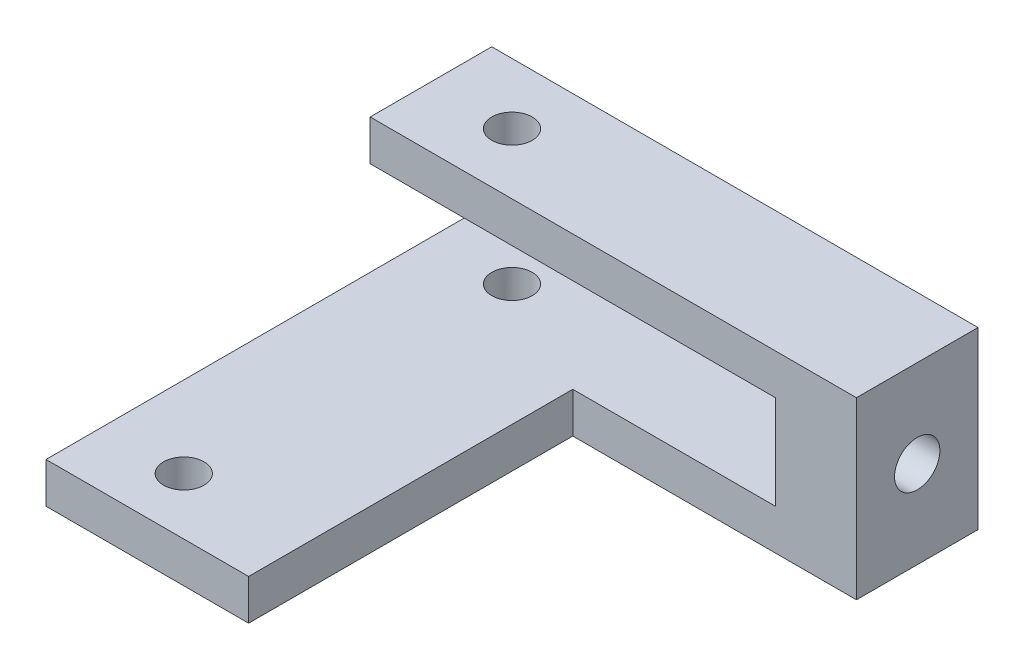
ISO-10303-21;
HEADER;
FILE_DESCRIPTION(('STEP AP214'),'2;1');
FILE_NAME('part.step','',(''),(''),'','','');
FILE_SCHEMA(('AUTOMOTIVE_DESIGN { 1 0 10303 214 1 1 1 1 }'));
ENDSEC;
DATA;
#1=APPLICATION_CONTEXT('core data for automotive mechanical design processes');
#2=APPLICATION_PROTOCOL_DEFINITION('international standard','automotive_design',2000,#1);
#3=PRODUCT_CONTEXT('',#1,'mechanical');
#4=PRODUCT('Part','Part','',(#3));
#5=PRODUCT_RELATED_PRODUCT_CATEGORY('part','',(#4));
#6=PRODUCT_DEFINITION_FORMATION('','',#4);
#7=PRODUCT_DEFINITION_CONTEXT('part definition',#1,'design');
#8=PRODUCT_DEFINITION('design','',#6,#7);
#9=PRODUCT_DEFINITION_SHAPE('','',#8);
#10=(LENGTH_UNIT() NAMED_UNIT(*) SI_UNIT(.MILLI.,.METRE.));
#11=(NAMED_UNIT(*) PLANE_ANGLE_UNIT() SI_UNIT($,.RADIAN.));
#12=(NAMED_UNIT(*) SI_UNIT($,.STERADIAN.) SOLID_ANGLE_UNIT());
#13=UNCERTAINTY_MEASURE_WITH_UNIT(LENGTH_MEASURE(1.E-05),#10,'distance_accuracy_value','');
#14=(GEOMETRIC_REPRESENTATION_CONTEXT(3) GLOBAL_UNCERTAINTY_ASSIGNED_CONTEXT((#13)) GLOBAL_UNIT_ASSIGNED_CONTEXT((#10,
#11,#12)) REPRESENTATION_CONTEXT('',''));
#15=CARTESIAN_POINT('',(0.,0.,0.));
#16=DIRECTION('',(0.,0.,1.));
#17=DIRECTION('',(1.,0.,0.));
#18=AXIS2_PLACEMENT_3D('',#15,#16,#17);
#19=CARTESIAN_POINT('',(0.,0.,19.05));
#20=DIRECTION('',(-1.,0.,0.));
#21=DIRECTION('',(0.,1.,0.));
#22=AXIS2_PLACEMENT_3D('',#19,#20,#21);
#23=PLANE('',#22);
#24=CARTESIAN_POINT('',(0.,-13.716,9.525));
#25=DIRECTION('',(-1.,0.,0.));
#26=DIRECTION('',(0.,0.,1.));
#27=AXIS2_PLACEMENT_3D('',#24,#25,#26);
#28=CIRCLE('',#27,3.556);
#29=CARTESIAN_POINT('',(0.,-13.716,13.081));
#30=VERTEX_POINT('',#29);
#31=EDGE_CURVE('E288',#30,#30,#28,.T.);
#32=ORIENTED_EDGE('',*,*,#31,.T.);
#33=EDGE_LOOP('',(#32));
#34=FACE_BOUND('',#33,.T.);
#35=DIRECTION('',(0.,-1.,0.));
#36=VECTOR('',#35,1.);
#37=CARTESIAN_POINT('',(0.,0.,0.));
#38=LINE('',#37,#36);
#39=CARTESIAN_POINT('',(0.,0.,0.));
#40=VERTEX_POINT('',#39);
#41=CARTESIAN_POINT('',(0.,-27.432,0.));
#42=VERTEX_POINT('',#41);
#43=EDGE_CURVE('E152',#40,#42,#38,.T.);
#44=ORIENTED_EDGE('',*,*,#43,.F.);
#45=DIRECTION('',(0.,0.,-1.));
#46=VECTOR('',#45,1.);
#47=CARTESIAN_POINT('',(0.,0.,19.05));
#48=LINE('',#47,#46);
#49=CARTESIAN_POINT('',(0.,0.,19.05));
#50=VERTEX_POINT('',#49);
#51=EDGE_CURVE('E151',#50,#40,#48,.T.);
#52=ORIENTED_EDGE('',*,*,#51,.F.);
#53=DIRECTION('',(0.,-1.,0.));
#54=VECTOR('',#53,1.);
#55=CARTESIAN_POINT('',(0.,0.,19.05));
#56=LINE('',#55,#54);
#57=CARTESIAN_POINT('',(0.,-27.432,19.05));
#58=VERTEX_POINT('',#57);
#59=EDGE_CURVE('E179',#50,#58,#56,.T.);
#60=ORIENTED_EDGE('',*,*,#59,.T.);
#61=DIRECTION('',(0.,0.,-1.));
#62=VECTOR('',#61,1.);
#63=CARTESIAN_POINT('',(0.,-27.432,19.05));
#64=LINE('',#63,#62);
#65=EDGE_CURVE('E11',#58,#42,#64,.T.);
#66=ORIENTED_EDGE('',*,*,#65,.T.);
#67=EDGE_LOOP('',(#44,#52,#60,#66));
#68=FACE_BOUND('',#67,.T.);
#69=ADVANCED_FACE('F41',(#34,#68),#23,.F.);
#70=CARTESIAN_POINT('',(0.,-27.432,19.05));
#71=DIRECTION('',(0.,1.,0.));
#72=DIRECTION('',(0.,0.,1.));
#73=AXIS2_PLACEMENT_3D('',#70,#71,#72);
#74=PLANE('',#73);
#75=CARTESIAN_POINT('',(-63.5,-27.432,60.96));
#76=DIRECTION('',(0.,-1.,0.));
#77=DIRECTION('',(0.,0.,1.));
#78=AXIS2_PLACEMENT_3D('',#75,#76,#77);
#79=CIRCLE('',#78,3.175);
#80=CARTESIAN_POINT('',(-63.5,-27.432,64.135));
#81=VERTEX_POINT('',#80);
#82=EDGE_CURVE('E213',#81,#81,#79,.T.);
#83=ORIENTED_EDGE('',*,*,#82,.F.);
#84=EDGE_LOOP('',(#83));
#85=FACE_BOUND('',#84,.T.);
#86=CARTESIAN_POINT('',(-63.5,-27.432,9.525));
#87=DIRECTION('',(0.,-1.,0.));
#88=DIRECTION('',(0.,0.,1.));
#89=AXIS2_PLACEMENT_3D('',#86,#87,#88);
#90=CIRCLE('',#89,3.175);
#91=CARTESIAN_POINT('',(-63.5,-27.432,12.7));
#92=VERTEX_POINT('',#91);
#93=EDGE_CURVE('E408',#92,#92,#90,.T.);
#94=ORIENTED_EDGE('',*,*,#93,.F.);
#95=EDGE_LOOP('',(#94));
#96=FACE_BOUND('',#95,.T.);
#97=DIRECTION('',(-1.,0.,0.));
#98=VECTOR('',#97,1.);
#99=CARTESIAN_POINT('',(0.,-27.432,0.));
#100=LINE('',#99,#98);
#101=CARTESIAN_POINT('',(-76.2,-27.432,0.));
#102=VERTEX_POINT('',#101);
#103=EDGE_CURVE('E155',#42,#102,#100,.T.);
#104=ORIENTED_EDGE('',*,*,#103,.F.);
#105=ORIENTED_EDGE('',*,*,#65,.F.);
#106=DIRECTION('',(-1.,0.,0.));
#107=VECTOR('',#106,1.);
#108=CARTESIAN_POINT('',(0.,-27.432,19.05));
#109=LINE('',#108,#107);
#110=CARTESIAN_POINT('',(-44.45,-27.432,19.05));
#111=VERTEX_POINT('',#110);
#112=EDGE_CURVE('E106',#58,#111,#109,.T.);
#113=ORIENTED_EDGE('',*,*,#112,.T.);
#114=DIRECTION('',(0.,0.,-1.));
#115=VECTOR('',#114,1.);
#116=CARTESIAN_POINT('',(-44.45,-27.432,69.85));
#117=LINE('',#116,#115);
#118=CARTESIAN_POINT('',(-44.45,-27.432,69.85));
#119=VERTEX_POINT('',#118);
#120=EDGE_CURVE('E156',#119,#111,#117,.T.);
#121=ORIENTED_EDGE('',*,*,#120,.F.);
#122=DIRECTION('',(-1.,0.,0.));
#123=VECTOR('',#122,1.);
#124=CARTESIAN_POINT('',(-44.45,-27.432,69.85));
#125=LINE('',#124,#123);
#126=CARTESIAN_POINT('',(-76.2,-27.432,69.85));
#127=VERTEX_POINT('',#126);
#128=EDGE_CURVE('E220',#119,#127,#125,.T.);
#129=ORIENTED_EDGE('',*,*,#128,.T.);
#130=DIRECTION('',(0.,0.,-1.));
#131=VECTOR('',#130,1.);
#132=CARTESIAN_POINT('',(-76.2,-27.432,19.05));
#133=LINE('',#132,#131);
#134=EDGE_CURVE('E50',#127,#102,#133,.T.);
#135=ORIENTED_EDGE('',*,*,#134,.T.);
#136=EDGE_LOOP('',(#104,#105,#113,#121,#129,#135));
#137=FACE_BOUND('',#136,.T.);
#138=ADVANCED_FACE('F279',(#85,#96,#137),#74,.F.);
#139=CARTESIAN_POINT('',(-76.2,-21.082,19.05));
#140=DIRECTION('',(1.,0.,0.));
#141=DIRECTION('',(0.,-1.,0.));
#142=AXIS2_PLACEMENT_3D('',#139,#140,#141);
#143=PLANE('',#142);
#144=DIRECTION('',(0.,1.,0.));
#145=VECTOR('',#144,1.);
#146=CARTESIAN_POINT('',(-76.2,-21.082,0.));
#147=LINE('',#146,#145);
#148=CARTESIAN_POINT('',(-76.2,-21.082,0.));
#149=VERTEX_POINT('',#148);
#150=EDGE_CURVE('E160',#102,#149,#147,.T.);
#151=ORIENTED_EDGE('',*,*,#150,.F.);
#152=ORIENTED_EDGE('',*,*,#134,.F.);
#153=DIRECTION('',(0.,1.,0.));
#154=VECTOR('',#153,1.);
#155=CARTESIAN_POINT('',(-76.2,-21.082,69.85));
#156=LINE('',#155,#154);
#157=CARTESIAN_POINT('',(-76.2,-21.082,69.85));
#158=VERTEX_POINT('',#157);
#159=EDGE_CURVE('E224',#127,#158,#156,.T.);
#160=ORIENTED_EDGE('',*,*,#159,.T.);
#161=DIRECTION('',(0.,0.,-1.));
#162=VECTOR('',#161,1.);
#163=CARTESIAN_POINT('',(-76.2,-21.082,19.05));
#164=LINE('',#163,#162);
#165=EDGE_CURVE('E190',#158,#149,#164,.T.);
#166=ORIENTED_EDGE('',*,*,#165,.T.);
#167=EDGE_LOOP('',(#151,#152,#160,#166));
#168=FACE_BOUND('',#167,.T.);
#169=ADVANCED_FACE('F253',(#168),#143,.F.);
#170=CARTESIAN_POINT('',(-12.7,-21.082,19.05));
#171=DIRECTION('',(0.,-1.,0.));
#172=DIRECTION('',(0.,0.,-1.));
#173=AXIS2_PLACEMENT_3D('',#170,#171,#172);
#174=PLANE('',#173);
#175=CARTESIAN_POINT('',(-63.5,-21.082,60.96));
#176=DIRECTION('',(0.,1.,0.));
#177=DIRECTION('',(0.,0.,-1.));
#178=AXIS2_PLACEMENT_3D('',#175,#176,#177);
#179=CIRCLE('',#178,3.175);
#180=CARTESIAN_POINT('',(-63.5,-21.082,57.785));
#181=VERTEX_POINT('',#180);
#182=EDGE_CURVE('E196',#181,#181,#179,.T.);
#183=ORIENTED_EDGE('',*,*,#182,.F.);
#184=EDGE_LOOP('',(#183));
#185=FACE_BOUND('',#184,.T.);
#186=CARTESIAN_POINT('',(-63.5,-21.082,9.525));
#187=DIRECTION('',(0.,1.,0.));
#188=DIRECTION('',(0.,0.,-1.));
#189=AXIS2_PLACEMENT_3D('',#186,#187,#188);
#190=CIRCLE('',#189,3.175);
#191=CARTESIAN_POINT('',(-63.5,-21.082,6.35000000000001));
#192=VERTEX_POINT('',#191);
#193=EDGE_CURVE('E199',#192,#192,#190,.T.);
#194=ORIENTED_EDGE('',*,*,#193,.F.);
#195=EDGE_LOOP('',(#194));
#196=FACE_BOUND('',#195,.T.);
#197=DIRECTION('',(1.,0.,0.));
#198=VECTOR('',#197,1.);
#199=CARTESIAN_POINT('',(-12.7,-21.082,0.));
#200=LINE('',#199,#198);
#201=CARTESIAN_POINT('',(-12.7,-21.082,0.));
#202=VERTEX_POINT('',#201);
#203=EDGE_CURVE('E164',#149,#202,#200,.T.);
#204=ORIENTED_EDGE('',*,*,#203,.F.);
#205=ORIENTED_EDGE('',*,*,#165,.F.);
#206=DIRECTION('',(1.,0.,0.));
#207=VECTOR('',#206,1.);
#208=CARTESIAN_POINT('',(-44.45,-21.082,69.85));
#209=LINE('',#208,#207);
#210=CARTESIAN_POINT('',(-44.45,-21.082,69.85));
#211=VERTEX_POINT('',#210);
#212=EDGE_CURVE('E228',#158,#211,#209,.T.);
#213=ORIENTED_EDGE('',*,*,#212,.T.);
#214=DIRECTION('',(0.,0.,-1.));
#215=VECTOR('',#214,1.);
#216=CARTESIAN_POINT('',(-44.45,-21.082,69.85));
#217=LINE('',#216,#215);
#218=CARTESIAN_POINT('',(-44.45,-21.082,19.05));
#219=VERTEX_POINT('',#218);
#220=EDGE_CURVE('E231',#211,#219,#217,.T.);
#221=ORIENTED_EDGE('',*,*,#220,.T.);
#222=DIRECTION('',(1.,0.,0.));
#223=VECTOR('',#222,1.);
#224=CARTESIAN_POINT('',(-12.7,-21.082,19.05));
#225=LINE('',#224,#223);
#226=CARTESIAN_POINT('',(-12.7,-21.082,19.05));
#227=VERTEX_POINT('',#226);
#228=EDGE_CURVE('E145',#219,#227,#225,.T.);
#229=ORIENTED_EDGE('',*,*,#228,.T.);
#230=DIRECTION('',(0.,0.,-1.));
#231=VECTOR('',#230,1.);
#232=CARTESIAN_POINT('',(-12.7,-21.082,19.05));
#233=LINE('',#232,#231);
#234=EDGE_CURVE('E186',#227,#202,#233,.T.);
#235=ORIENTED_EDGE('',*,*,#234,.T.);
#236=EDGE_LOOP('',(#204,#205,#213,#221,#229,#235));
#237=FACE_BOUND('',#236,.T.);
#238=ADVANCED_FACE('F245',(#185,#196,#237),#174,.F.);
#239=CARTESIAN_POINT('',(-12.7,-6.35,19.05));
#240=DIRECTION('',(1.,0.,0.));
#241=DIRECTION('',(0.,-1.,0.));
#242=AXIS2_PLACEMENT_3D('',#239,#240,#241);
#243=PLANE('',#242);
#244=CARTESIAN_POINT('',(-12.7,-13.716,9.525));
#245=DIRECTION('',(-1.,0.,0.));
#246=DIRECTION('',(0.,-1.,0.));
#247=AXIS2_PLACEMENT_3D('',#244,#245,#246);
#248=CIRCLE('',#247,3.556);
#249=CARTESIAN_POINT('',(-12.7,-17.272,9.525));
#250=VERTEX_POINT('',#249);
#251=EDGE_CURVE('E44',#250,#250,#248,.T.);
#252=ORIENTED_EDGE('',*,*,#251,.F.);
#253=EDGE_LOOP('',(#252));
#254=FACE_BOUND('',#253,.T.);
#255=DIRECTION('',(0.,1.,0.));
#256=VECTOR('',#255,1.);
#257=CARTESIAN_POINT('',(-12.7,-6.35,0.));
#258=LINE('',#257,#256);
#259=CARTESIAN_POINT('',(-12.7,-6.35,0.));
#260=VERTEX_POINT('',#259);
#261=EDGE_CURVE('E168',#202,#260,#258,.T.);
#262=ORIENTED_EDGE('',*,*,#261,.F.);
#263=ORIENTED_EDGE('',*,*,#234,.F.);
#264=DIRECTION('',(0.,1.,0.));
#265=VECTOR('',#264,1.);
#266=CARTESIAN_POINT('',(-12.7,-6.35,19.05));
#267=LINE('',#266,#265);
#268=CARTESIAN_POINT('',(-12.7,-6.35,19.05));
#269=VERTEX_POINT('',#268);
#270=EDGE_CURVE('E142',#227,#269,#267,.T.);
#271=ORIENTED_EDGE('',*,*,#270,.T.);
#272=DIRECTION('',(0.,0.,-1.));
#273=VECTOR('',#272,1.);
#274=CARTESIAN_POINT('',(-12.7,-6.35,19.05));
#275=LINE('',#274,#273);
#276=EDGE_CURVE('E135',#269,#260,#275,.T.);
#277=ORIENTED_EDGE('',*,*,#276,.T.);
#278=EDGE_LOOP('',(#262,#263,#271,#277));
#279=FACE_BOUND('',#278,.T.);
#280=ADVANCED_FACE('F248',(#254,#279),#243,.F.);
#281=CARTESIAN_POINT('',(-12.7,-6.35,19.05));
#282=DIRECTION('',(0.,1.,0.));
#283=DIRECTION('',(0.,0.,1.));
#284=AXIS2_PLACEMENT_3D('',#281,#282,#283);
#285=PLANE('',#284);
#286=CARTESIAN_POINT('',(-63.5,-6.35000000000001,9.525));
#287=DIRECTION('',(0.,-1.,0.));
#288=DIRECTION('',(0.,0.,1.));
#289=AXIS2_PLACEMENT_3D('',#286,#287,#288);
#290=CIRCLE('',#289,3.175);
#291=CARTESIAN_POINT('',(-63.5,-6.35000000000001,12.7));
#292=VERTEX_POINT('',#291);
#293=EDGE_CURVE('E207',#292,#292,#290,.T.);
#294=ORIENTED_EDGE('',*,*,#293,.F.);
#295=EDGE_LOOP('',(#294));
#296=FACE_BOUND('',#295,.T.);
#297=DIRECTION('',(-1.,0.,0.));
#298=VECTOR('',#297,1.);
#299=CARTESIAN_POINT('',(-12.7,-6.35,0.));
#300=LINE('',#299,#298);
#301=CARTESIAN_POINT('',(-76.2,-6.35000000000002,0.));
#302=VERTEX_POINT('',#301);
#303=EDGE_CURVE('E172',#260,#302,#300,.T.);
#304=ORIENTED_EDGE('',*,*,#303,.F.);
#305=ORIENTED_EDGE('',*,*,#276,.F.);
#306=DIRECTION('',(-1.,0.,0.));
#307=VECTOR('',#306,1.);
#308=CARTESIAN_POINT('',(-12.7,-6.35,19.05));
#309=LINE('',#308,#307);
#310=CARTESIAN_POINT('',(-76.2,-6.35000000000002,19.05));
#311=VERTEX_POINT('',#310);
#312=EDGE_CURVE('E122',#269,#311,#309,.T.);
#313=ORIENTED_EDGE('',*,*,#312,.T.);
#314=DIRECTION('',(0.,0.,-1.));
#315=VECTOR('',#314,1.);
#316=CARTESIAN_POINT('',(-76.2,-6.35000000000002,19.05));
#317=LINE('',#316,#315);
#318=EDGE_CURVE('E129',#311,#302,#317,.T.);
#319=ORIENTED_EDGE('',*,*,#318,.T.);
#320=EDGE_LOOP('',(#304,#305,#313,#319));
#321=FACE_BOUND('',#320,.T.);
#322=ADVANCED_FACE('F138',(#296,#321),#285,.F.);
#323=CARTESIAN_POINT('',(-76.2,0.,19.05));
#324=DIRECTION('',(1.,0.,0.));
#325=DIRECTION('',(0.,0.,1.));
#326=AXIS2_PLACEMENT_3D('',#323,#324,#325);
#327=PLANE('',#326);
#328=DIRECTION('',(0.,1.,0.));
#329=VECTOR('',#328,1.);
#330=CARTESIAN_POINT('',(-76.2,0.,0.));
#331=LINE('',#330,#329);
#332=CARTESIAN_POINT('',(-76.2,0.,0.));
#333=VERTEX_POINT('',#332);
#334=EDGE_CURVE('E131',#302,#333,#331,.T.);
#335=ORIENTED_EDGE('',*,*,#334,.F.);
#336=ORIENTED_EDGE('',*,*,#318,.F.);
#337=DIRECTION('',(0.,1.,0.));
#338=VECTOR('',#337,1.);
#339=CARTESIAN_POINT('',(-76.2,0.,19.05));
#340=LINE('',#339,#338);
#341=CARTESIAN_POINT('',(-76.2,0.,19.05));
#342=VERTEX_POINT('',#341);
#343=EDGE_CURVE('E118',#311,#342,#340,.T.);
#344=ORIENTED_EDGE('',*,*,#343,.T.);
#345=DIRECTION('',(0.,0.,-1.));
#346=VECTOR('',#345,1.);
#347=CARTESIAN_POINT('',(-76.2,0.,19.05));
#348=LINE('',#347,#346);
#349=EDGE_CURVE('E136',#342,#333,#348,.T.);
#350=ORIENTED_EDGE('',*,*,#349,.T.);
#351=EDGE_LOOP('',(#335,#336,#344,#350));
#352=FACE_BOUND('',#351,.T.);
#353=ADVANCED_FACE('F130',(#352),#327,.F.);
#354=CARTESIAN_POINT('',(0.,0.,19.05));
#355=DIRECTION('',(0.,-1.,0.));
#356=DIRECTION('',(0.,0.,-1.));
#357=AXIS2_PLACEMENT_3D('',#354,#355,#356);
#358=PLANE('',#357);
#359=CARTESIAN_POINT('',(-63.5,0.,9.525));
#360=DIRECTION('',(0.,-1.,0.));
#361=DIRECTION('',(0.,0.,1.));
#362=AXIS2_PLACEMENT_3D('',#359,#360,#361);
#363=CIRCLE('',#362,3.175);
#364=CARTESIAN_POINT('',(-63.5,0.,12.7));
#365=VERTEX_POINT('',#364);
#366=EDGE_CURVE('E405',#365,#365,#363,.T.);
#367=ORIENTED_EDGE('',*,*,#366,.T.);
#368=EDGE_LOOP('',(#367));
#369=FACE_BOUND('',#368,.T.);
#370=DIRECTION('',(1.,0.,0.));
#371=VECTOR('',#370,1.);
#372=CARTESIAN_POINT('',(0.,0.,0.));
#373=LINE('',#372,#371);
#374=EDGE_CURVE('E100',#333,#40,#373,.T.);
#375=ORIENTED_EDGE('',*,*,#374,.F.);
#376=ORIENTED_EDGE('',*,*,#349,.F.);
#377=DIRECTION('',(1.,0.,0.));
#378=VECTOR('',#377,1.);
#379=CARTESIAN_POINT('',(0.,0.,19.05));
#380=LINE('',#379,#378);
#381=EDGE_CURVE('E67',#342,#50,#380,.T.);
#382=ORIENTED_EDGE('',*,*,#381,.T.);
#383=ORIENTED_EDGE('',*,*,#51,.T.);
#384=EDGE_LOOP('',(#375,#376,#382,#383));
#385=FACE_BOUND('',#384,.T.);
#386=ADVANCED_FACE('F292',(#369,#385),#358,.F.);
#387=CARTESIAN_POINT('',(0.,0.,19.05));
#388=DIRECTION('',(0.,0.,1.));
#389=DIRECTION('',(-1.,0.,0.));
#390=AXIS2_PLACEMENT_3D('',#387,#388,#389);
#391=PLANE('',#390);
#392=DIRECTION('',(0.,-1.,0.));
#393=VECTOR('',#392,1.);
#394=CARTESIAN_POINT('',(-44.45,-21.082,19.05));
#395=LINE('',#394,#393);
#396=EDGE_CURVE('E58',#219,#111,#395,.T.);
#397=ORIENTED_EDGE('',*,*,#396,.T.);
#398=ORIENTED_EDGE('',*,*,#112,.F.);
#399=ORIENTED_EDGE('',*,*,#59,.F.);
#400=ORIENTED_EDGE('',*,*,#381,.F.);
#401=ORIENTED_EDGE('',*,*,#343,.F.);
#402=ORIENTED_EDGE('',*,*,#312,.F.);
#403=ORIENTED_EDGE('',*,*,#270,.F.);
#404=ORIENTED_EDGE('',*,*,#228,.F.);
#405=EDGE_LOOP('',(#397,#398,#399,#400,#401,#402,#403,#404));
#406=FACE_BOUND('',#405,.T.);
#407=ADVANCED_FACE('F120',(#406),#391,.T.);
#408=CARTESIAN_POINT('',(0.,0.,0.));
#409=DIRECTION('',(0.,0.,1.));
#410=DIRECTION('',(-1.,0.,0.));
#411=AXIS2_PLACEMENT_3D('',#408,#409,#410);
#412=PLANE('',#411);
#413=ORIENTED_EDGE('',*,*,#43,.T.);
#414=ORIENTED_EDGE('',*,*,#103,.T.);
#415=ORIENTED_EDGE('',*,*,#150,.T.);
#416=ORIENTED_EDGE('',*,*,#203,.T.);
#417=ORIENTED_EDGE('',*,*,#261,.T.);
#418=ORIENTED_EDGE('',*,*,#303,.T.);
#419=ORIENTED_EDGE('',*,*,#334,.T.);
#420=ORIENTED_EDGE('',*,*,#374,.T.);
#421=EDGE_LOOP('',(#413,#414,#415,#416,#417,#418,#419,#420));
#422=FACE_BOUND('',#421,.T.);
#423=ADVANCED_FACE('F249',(#422),#412,.F.);
#424=CARTESIAN_POINT('',(-44.45,-21.082,69.85));
#425=DIRECTION('',(-1.,0.,0.));
#426=DIRECTION('',(0.,0.,-1.));
#427=AXIS2_PLACEMENT_3D('',#424,#425,#426);
#428=PLANE('',#427);
#429=ORIENTED_EDGE('',*,*,#396,.F.);
#430=ORIENTED_EDGE('',*,*,#220,.F.);
#431=DIRECTION('',(0.,-1.,0.));
#432=VECTOR('',#431,1.);
#433=CARTESIAN_POINT('',(-44.45,-21.082,69.85));
#434=LINE('',#433,#432);
#435=EDGE_CURVE('E204',#211,#119,#434,.T.);
#436=ORIENTED_EDGE('',*,*,#435,.T.);
#437=ORIENTED_EDGE('',*,*,#120,.T.);
#438=EDGE_LOOP('',(#429,#430,#436,#437));
#439=FACE_BOUND('',#438,.T.);
#440=ADVANCED_FACE('F267',(#439),#428,.F.);
#441=CARTESIAN_POINT('',(0.,0.,69.85));
#442=DIRECTION('',(0.,0.,1.));
#443=DIRECTION('',(-1.,0.,0.));
#444=AXIS2_PLACEMENT_3D('',#441,#442,#443);
#445=PLANE('',#444);
#446=ORIENTED_EDGE('',*,*,#435,.F.);
#447=ORIENTED_EDGE('',*,*,#212,.F.);
#448=ORIENTED_EDGE('',*,*,#159,.F.);
#449=ORIENTED_EDGE('',*,*,#128,.F.);
#450=EDGE_LOOP('',(#446,#447,#448,#449));
#451=FACE_BOUND('',#450,.T.);
#452=ADVANCED_FACE('F262',(#451),#445,.T.);
#453=CARTESIAN_POINT('',(-63.5,-27.432,9.525));
#454=DIRECTION('',(0.,1.,0.));
#455=DIRECTION('',(0.,0.,1.));
#456=AXIS2_PLACEMENT_3D('',#453,#454,#455);
#457=CYLINDRICAL_SURFACE('',#456,3.175);
#458=ORIENTED_EDGE('',*,*,#366,.F.);
#459=EDGE_LOOP('',(#458));
#460=FACE_BOUND('',#459,.T.);
#461=ORIENTED_EDGE('',*,*,#293,.T.);
#462=EDGE_LOOP('',(#461));
#463=FACE_BOUND('',#462,.T.);
#464=ADVANCED_FACE('F274',(#460,#463),#457,.F.);
#465=ORIENTED_EDGE('',*,*,#93,.T.);
#466=EDGE_LOOP('',(#465));
#467=FACE_BOUND('',#466,.T.);
#468=ORIENTED_EDGE('',*,*,#193,.T.);
#469=EDGE_LOOP('',(#468));
#470=FACE_BOUND('',#469,.T.);
#471=ADVANCED_FACE('F368',(#467,#470),#457,.F.);
#472=CARTESIAN_POINT('',(-63.5,-27.432,60.96));
#473=DIRECTION('',(0.,1.,0.));
#474=DIRECTION('',(0.,0.,1.));
#475=AXIS2_PLACEMENT_3D('',#472,#473,#474);
#476=CYLINDRICAL_SURFACE('',#475,3.175);
#477=ORIENTED_EDGE('',*,*,#82,.T.);
#478=EDGE_LOOP('',(#477));
#479=FACE_BOUND('',#478,.T.);
#480=ORIENTED_EDGE('',*,*,#182,.T.);
#481=EDGE_LOOP('',(#480));
#482=FACE_BOUND('',#481,.T.);
#483=ADVANCED_FACE('F378',(#479,#482),#476,.F.);
#484=CARTESIAN_POINT('',(-50.8,-13.716,9.525));
#485=DIRECTION('',(1.,0.,0.));
#486=DIRECTION('',(0.,0.,1.));
#487=AXIS2_PLACEMENT_3D('',#484,#485,#486);
#488=CYLINDRICAL_SURFACE('',#487,3.556);
#489=ORIENTED_EDGE('',*,*,#31,.F.);
#490=EDGE_LOOP('',(#489));
#491=FACE_BOUND('',#490,.T.);
#492=ORIENTED_EDGE('',*,*,#251,.T.);
#493=EDGE_LOOP('',(#492));
#494=FACE_BOUND('',#493,.T.);
#495=ADVANCED_FACE('F387',(#491,#494),#488,.F.);
#496=CLOSED_SHELL('',(#69,#138,#169,#238,#280,#322,#353,#386,#407,#423,#440,#452,#464,#471,#483,#495));
#497=MANIFOLD_SOLID_BREP('B2',#496);
#498=ADVANCED_BREP_SHAPE_REPRESENTATION('',(#18,#497),#14);
#499=SHAPE_DEFINITION_REPRESENTATION(#9,#498);
ENDSEC;
END-ISO-10303-21;
